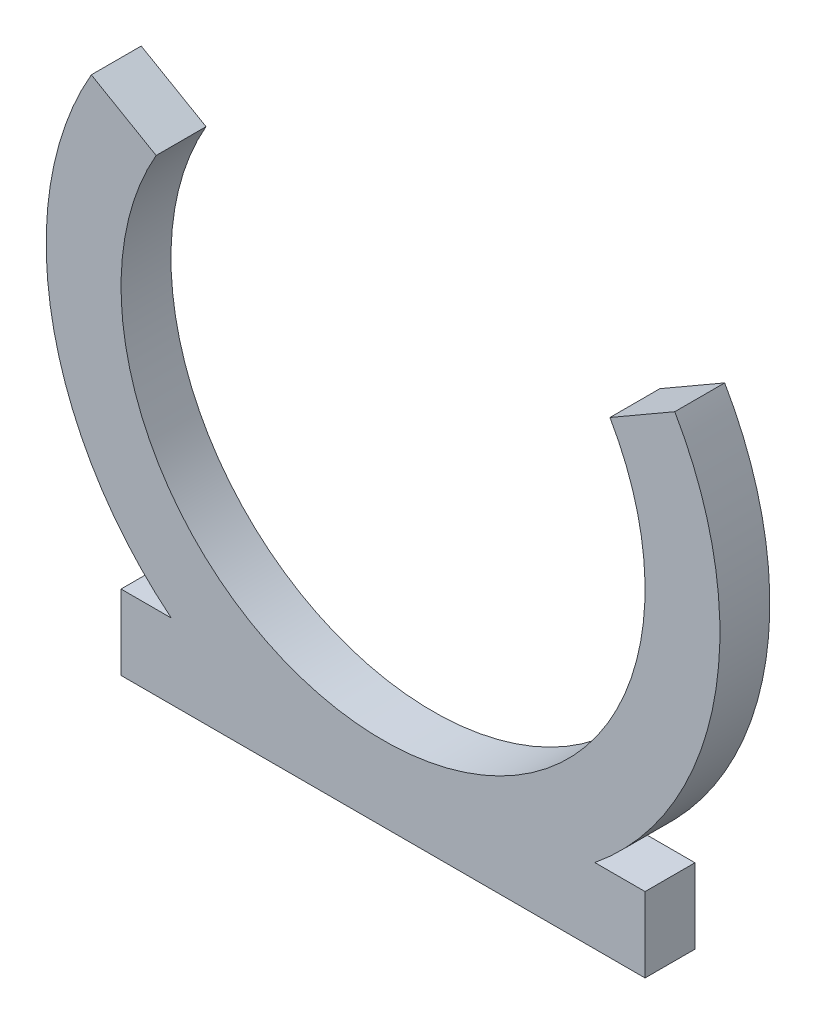
ISO-10303-21;
HEADER;
FILE_DESCRIPTION(('STEP AP214'),'2;1');
FILE_NAME('part.step','',(''),(''),'','','');
FILE_SCHEMA(('AUTOMOTIVE_DESIGN { 1 0 10303 214 1 1 1 1 }'));
ENDSEC;
DATA;
#1=APPLICATION_CONTEXT('core data for automotive mechanical design processes');
#2=APPLICATION_PROTOCOL_DEFINITION('international standard','automotive_design',2000,#1);
#3=PRODUCT_CONTEXT('',#1,'mechanical');
#4=PRODUCT('Part','Part','',(#3));
#5=PRODUCT_RELATED_PRODUCT_CATEGORY('part','',(#4));
#6=PRODUCT_DEFINITION_FORMATION('','',#4);
#7=PRODUCT_DEFINITION_CONTEXT('part definition',#1,'design');
#8=PRODUCT_DEFINITION('design','',#6,#7);
#9=PRODUCT_DEFINITION_SHAPE('','',#8);
#10=(LENGTH_UNIT() NAMED_UNIT(*) SI_UNIT(.MILLI.,.METRE.));
#11=(NAMED_UNIT(*) PLANE_ANGLE_UNIT() SI_UNIT($,.RADIAN.));
#12=(NAMED_UNIT(*) SI_UNIT($,.STERADIAN.) SOLID_ANGLE_UNIT());
#13=UNCERTAINTY_MEASURE_WITH_UNIT(LENGTH_MEASURE(1.E-05),#10,'distance_accuracy_value','');
#14=(GEOMETRIC_REPRESENTATION_CONTEXT(3) GLOBAL_UNCERTAINTY_ASSIGNED_CONTEXT((#13)) GLOBAL_UNIT_ASSIGNED_CONTEXT((#10,
#11,#12)) REPRESENTATION_CONTEXT('',''));
#15=CARTESIAN_POINT('',(0.,0.,0.));
#16=DIRECTION('',(0.,0.,1.));
#17=DIRECTION('',(1.,0.,0.));
#18=AXIS2_PLACEMENT_3D('',#15,#16,#17);
#19=CARTESIAN_POINT('',(0.,0.,2.));
#20=DIRECTION('',(0.,0.,-1.));
#21=DIRECTION('',(-1.,0.,0.));
#22=AXIS2_PLACEMENT_3D('',#19,#20,#21);
#23=CYLINDRICAL_SURFACE('',#22,10.5);
#24=CARTESIAN_POINT('',(0.,0.,0.));
#25=DIRECTION('',(0.,0.,-1.));
#26=DIRECTION('',(1.,0.,0.));
#27=AXIS2_PLACEMENT_3D('',#24,#25,#26);
#28=CIRCLE('',#27,10.5);
#29=CARTESIAN_POINT('',(9.09326673973662,5.24999999999998,0.));
#30=VERTEX_POINT('',#29);
#31=CARTESIAN_POINT('',(-9.09326673973662,5.24999999999998,0.));
#32=VERTEX_POINT('',#31);
#33=EDGE_CURVE('E152',#30,#32,#28,.T.);
#34=ORIENTED_EDGE('',*,*,#33,.T.);
#35=DIRECTION('',(0.,0.,-1.));
#36=VECTOR('',#35,1.);
#37=CARTESIAN_POINT('',(-9.09326673973662,5.24999999999998,2.));
#38=LINE('',#37,#36);
#39=CARTESIAN_POINT('',(-9.09326673973662,5.24999999999998,2.));
#40=VERTEX_POINT('',#39);
#41=EDGE_CURVE('E11',#40,#32,#38,.T.);
#42=ORIENTED_EDGE('',*,*,#41,.F.);
#43=CARTESIAN_POINT('',(0.,0.,2.));
#44=DIRECTION('',(0.,0.,-1.));
#45=DIRECTION('',(1.,0.,0.));
#46=AXIS2_PLACEMENT_3D('',#43,#44,#45);
#47=CIRCLE('',#46,10.5);
#48=CARTESIAN_POINT('',(9.09326673973662,5.24999999999998,2.));
#49=VERTEX_POINT('',#48);
#50=EDGE_CURVE('E180',#49,#40,#47,.T.);
#51=ORIENTED_EDGE('',*,*,#50,.F.);
#52=DIRECTION('',(0.,0.,-1.));
#53=VECTOR('',#52,1.);
#54=CARTESIAN_POINT('',(9.09326673973662,5.24999999999998,2.));
#55=LINE('',#54,#53);
#56=EDGE_CURVE('E148',#49,#30,#55,.T.);
#57=ORIENTED_EDGE('',*,*,#56,.T.);
#58=EDGE_LOOP('',(#34,#42,#51,#57));
#59=FACE_BOUND('',#58,.T.);
#60=ADVANCED_FACE('F39',(#59),#23,.F.);
#61=CARTESIAN_POINT('',(-9.09326673973662,5.24999999999998,2.));
#62=DIRECTION('',(-0.499999999999997,-0.86602540378444,0.));
#63=DIRECTION('',(0.86602540378444,-0.499999999999997,0.));
#64=AXIS2_PLACEMENT_3D('',#61,#62,#63);
#65=PLANE('',#64);
#66=DIRECTION('',(-0.86602540378444,0.499999999999997,0.));
#67=VECTOR('',#66,1.);
#68=CARTESIAN_POINT('',(-9.09326673973662,5.24999999999998,0.));
#69=LINE('',#68,#67);
#70=CARTESIAN_POINT('',(-11.6913429510899,6.74999999999997,0.));
#71=VERTEX_POINT('',#70);
#72=EDGE_CURVE('E156',#32,#71,#69,.T.);
#73=ORIENTED_EDGE('',*,*,#72,.T.);
#74=DIRECTION('',(0.,0.,-1.));
#75=VECTOR('',#74,1.);
#76=CARTESIAN_POINT('',(-11.6913429510899,6.74999999999997,2.));
#77=LINE('',#76,#75);
#78=CARTESIAN_POINT('',(-11.6913429510899,6.74999999999997,2.));
#79=VERTEX_POINT('',#78);
#80=EDGE_CURVE('E48',#79,#71,#77,.T.);
#81=ORIENTED_EDGE('',*,*,#80,.F.);
#82=DIRECTION('',(-0.86602540378444,0.499999999999997,0.));
#83=VECTOR('',#82,1.);
#84=CARTESIAN_POINT('',(-9.09326673973662,5.24999999999998,2.));
#85=LINE('',#84,#83);
#86=EDGE_CURVE('E105',#40,#79,#85,.T.);
#87=ORIENTED_EDGE('',*,*,#86,.F.);
#88=ORIENTED_EDGE('',*,*,#41,.T.);
#89=EDGE_LOOP('',(#73,#81,#87,#88));
#90=FACE_BOUND('',#89,.T.);
#91=ADVANCED_FACE('F244',(#90),#65,.F.);
#92=CARTESIAN_POINT('',(0.,0.,2.));
#93=DIRECTION('',(0.,0.,-1.));
#94=DIRECTION('',(-1.,0.,0.));
#95=AXIS2_PLACEMENT_3D('',#92,#93,#94);
#96=CYLINDRICAL_SURFACE('',#95,13.5);
#97=CARTESIAN_POINT('',(0.,0.,0.));
#98=DIRECTION('',(0.,0.,1.));
#99=DIRECTION('',(1.,0.,0.));
#100=AXIS2_PLACEMENT_3D('',#97,#98,#99);
#101=CIRCLE('',#100,13.5);
#102=CARTESIAN_POINT('',(-8.48528137423857,-10.5,0.));
#103=VERTEX_POINT('',#102);
#104=EDGE_CURVE('E159',#71,#103,#101,.T.);
#105=ORIENTED_EDGE('',*,*,#104,.T.);
#106=DIRECTION('',(0.,0.,-1.));
#107=VECTOR('',#106,1.);
#108=CARTESIAN_POINT('',(-8.48528137423857,-10.5,2.));
#109=LINE('',#108,#107);
#110=CARTESIAN_POINT('',(-8.48528137423857,-10.5,2.));
#111=VERTEX_POINT('',#110);
#112=EDGE_CURVE('E199',#111,#103,#109,.T.);
#113=ORIENTED_EDGE('',*,*,#112,.F.);
#114=CARTESIAN_POINT('',(0.,0.,2.));
#115=DIRECTION('',(0.,0.,1.));
#116=DIRECTION('',(1.,0.,0.));
#117=AXIS2_PLACEMENT_3D('',#114,#115,#116);
#118=CIRCLE('',#117,13.5);
#119=EDGE_CURVE('E209',#79,#111,#118,.T.);
#120=ORIENTED_EDGE('',*,*,#119,.F.);
#121=ORIENTED_EDGE('',*,*,#80,.T.);
#122=EDGE_LOOP('',(#105,#113,#120,#121));
#123=FACE_BOUND('',#122,.T.);
#124=ADVANCED_FACE('F207',(#123),#96,.T.);
#125=CARTESIAN_POINT('',(-10.5,-10.5,2.));
#126=DIRECTION('',(0.,-1.,0.));
#127=DIRECTION('',(1.,0.,0.));
#128=AXIS2_PLACEMENT_3D('',#125,#126,#127);
#129=PLANE('',#128);
#130=DIRECTION('',(-1.,0.,0.));
#131=VECTOR('',#130,1.);
#132=CARTESIAN_POINT('',(-10.5,-10.5,0.));
#133=LINE('',#132,#131);
#134=CARTESIAN_POINT('',(-10.5,-10.5,0.));
#135=VERTEX_POINT('',#134);
#136=EDGE_CURVE('E162',#103,#135,#133,.T.);
#137=ORIENTED_EDGE('',*,*,#136,.T.);
#138=DIRECTION('',(0.,0.,-1.));
#139=VECTOR('',#138,1.);
#140=CARTESIAN_POINT('',(-10.5,-10.5,2.));
#141=LINE('',#140,#139);
#142=CARTESIAN_POINT('',(-10.5,-10.5,2.));
#143=VERTEX_POINT('',#142);
#144=EDGE_CURVE('E195',#143,#135,#141,.T.);
#145=ORIENTED_EDGE('',*,*,#144,.F.);
#146=DIRECTION('',(-1.,0.,0.));
#147=VECTOR('',#146,1.);
#148=CARTESIAN_POINT('',(-10.5,-10.5,2.));
#149=LINE('',#148,#147);
#150=EDGE_CURVE('E228',#111,#143,#149,.T.);
#151=ORIENTED_EDGE('',*,*,#150,.F.);
#152=ORIENTED_EDGE('',*,*,#112,.T.);
#153=EDGE_LOOP('',(#137,#145,#151,#152));
#154=FACE_BOUND('',#153,.T.);
#155=ADVANCED_FACE('F218',(#154),#129,.F.);
#156=CARTESIAN_POINT('',(-10.5,-10.5,2.));
#157=DIRECTION('',(1.,0.,0.));
#158=DIRECTION('',(0.,1.,0.));
#159=AXIS2_PLACEMENT_3D('',#156,#157,#158);
#160=PLANE('',#159);
#161=DIRECTION('',(0.,-1.,0.));
#162=VECTOR('',#161,1.);
#163=CARTESIAN_POINT('',(-10.5,-10.5,0.));
#164=LINE('',#163,#162);
#165=CARTESIAN_POINT('',(-10.5,-13.5,0.));
#166=VERTEX_POINT('',#165);
#167=EDGE_CURVE('E165',#135,#166,#164,.T.);
#168=ORIENTED_EDGE('',*,*,#167,.T.);
#169=DIRECTION('',(0.,0.,-1.));
#170=VECTOR('',#169,1.);
#171=CARTESIAN_POINT('',(-10.5,-13.5,2.));
#172=LINE('',#171,#170);
#173=CARTESIAN_POINT('',(-10.5,-13.5,2.));
#174=VERTEX_POINT('',#173);
#175=EDGE_CURVE('E191',#174,#166,#172,.T.);
#176=ORIENTED_EDGE('',*,*,#175,.F.);
#177=DIRECTION('',(0.,-1.,0.));
#178=VECTOR('',#177,1.);
#179=CARTESIAN_POINT('',(-10.5,-10.5,2.));
#180=LINE('',#179,#178);
#181=EDGE_CURVE('E224',#143,#174,#180,.T.);
#182=ORIENTED_EDGE('',*,*,#181,.F.);
#183=ORIENTED_EDGE('',*,*,#144,.T.);
#184=EDGE_LOOP('',(#168,#176,#182,#183));
#185=FACE_BOUND('',#184,.T.);
#186=ADVANCED_FACE('F222',(#185),#160,.F.);
#187=CARTESIAN_POINT('',(-10.5,-13.5,2.));
#188=DIRECTION('',(0.,1.,0.));
#189=DIRECTION('',(0.,0.,1.));
#190=AXIS2_PLACEMENT_3D('',#187,#188,#189);
#191=PLANE('',#190);
#192=DIRECTION('',(1.,0.,0.));
#193=VECTOR('',#192,1.);
#194=CARTESIAN_POINT('',(-10.5,-13.5,0.));
#195=LINE('',#194,#193);
#196=CARTESIAN_POINT('',(10.5,-13.5,0.));
#197=VERTEX_POINT('',#196);
#198=EDGE_CURVE('E168',#166,#197,#195,.T.);
#199=ORIENTED_EDGE('',*,*,#198,.T.);
#200=DIRECTION('',(0.,0.,-1.));
#201=VECTOR('',#200,1.);
#202=CARTESIAN_POINT('',(10.5,-13.5,2.));
#203=LINE('',#202,#201);
#204=CARTESIAN_POINT('',(10.5,-13.5,2.));
#205=VERTEX_POINT('',#204);
#206=EDGE_CURVE('E187',#205,#197,#203,.T.);
#207=ORIENTED_EDGE('',*,*,#206,.F.);
#208=DIRECTION('',(1.,0.,0.));
#209=VECTOR('',#208,1.);
#210=CARTESIAN_POINT('',(-10.5,-13.5,2.));
#211=LINE('',#210,#209);
#212=EDGE_CURVE('E227',#174,#205,#211,.T.);
#213=ORIENTED_EDGE('',*,*,#212,.F.);
#214=ORIENTED_EDGE('',*,*,#175,.T.);
#215=EDGE_LOOP('',(#199,#207,#213,#214));
#216=FACE_BOUND('',#215,.T.);
#217=ADVANCED_FACE('F256',(#216),#191,.F.);
#218=CARTESIAN_POINT('',(10.5,-10.5,2.));
#219=DIRECTION('',(-1.,0.,0.));
#220=DIRECTION('',(0.,-1.,0.));
#221=AXIS2_PLACEMENT_3D('',#218,#219,#220);
#222=PLANE('',#221);
#223=DIRECTION('',(0.,1.,0.));
#224=VECTOR('',#223,1.);
#225=CARTESIAN_POINT('',(10.5,-10.5,0.));
#226=LINE('',#225,#224);
#227=CARTESIAN_POINT('',(10.5,-10.5,0.));
#228=VERTEX_POINT('',#227);
#229=EDGE_CURVE('E171',#197,#228,#226,.T.);
#230=ORIENTED_EDGE('',*,*,#229,.T.);
#231=DIRECTION('',(0.,0.,-1.));
#232=VECTOR('',#231,1.);
#233=CARTESIAN_POINT('',(10.5,-10.5,2.));
#234=LINE('',#233,#232);
#235=CARTESIAN_POINT('',(10.5,-10.5,2.));
#236=VERTEX_POINT('',#235);
#237=EDGE_CURVE('E141',#236,#228,#234,.T.);
#238=ORIENTED_EDGE('',*,*,#237,.F.);
#239=DIRECTION('',(0.,1.,0.));
#240=VECTOR('',#239,1.);
#241=CARTESIAN_POINT('',(10.5,-10.5,2.));
#242=LINE('',#241,#240);
#243=EDGE_CURVE('E130',#205,#236,#242,.T.);
#244=ORIENTED_EDGE('',*,*,#243,.F.);
#245=ORIENTED_EDGE('',*,*,#206,.T.);
#246=EDGE_LOOP('',(#230,#238,#244,#245));
#247=FACE_BOUND('',#246,.T.);
#248=ADVANCED_FACE('F259',(#247),#222,.F.);
#249=CARTESIAN_POINT('',(8.48528137423857,-10.5,2.));
#250=DIRECTION('',(0.,-1.,0.));
#251=DIRECTION('',(1.,0.,0.));
#252=AXIS2_PLACEMENT_3D('',#249,#250,#251);
#253=PLANE('',#252);
#254=DIRECTION('',(-1.,0.,0.));
#255=VECTOR('',#254,1.);
#256=CARTESIAN_POINT('',(8.48528137423857,-10.5,0.));
#257=LINE('',#256,#255);
#258=CARTESIAN_POINT('',(8.48528137423858,-10.5,0.));
#259=VERTEX_POINT('',#258);
#260=EDGE_CURVE('E139',#228,#259,#257,.T.);
#261=ORIENTED_EDGE('',*,*,#260,.T.);
#262=DIRECTION('',(0.,0.,-1.));
#263=VECTOR('',#262,1.);
#264=CARTESIAN_POINT('',(8.48528137423858,-10.5,2.));
#265=LINE('',#264,#263);
#266=CARTESIAN_POINT('',(8.48528137423858,-10.5,2.));
#267=VERTEX_POINT('',#266);
#268=EDGE_CURVE('E136',#267,#259,#265,.T.);
#269=ORIENTED_EDGE('',*,*,#268,.F.);
#270=DIRECTION('',(-1.,0.,0.));
#271=VECTOR('',#270,1.);
#272=CARTESIAN_POINT('',(8.48528137423857,-10.5,2.));
#273=LINE('',#272,#271);
#274=EDGE_CURVE('E124',#236,#267,#273,.T.);
#275=ORIENTED_EDGE('',*,*,#274,.F.);
#276=ORIENTED_EDGE('',*,*,#237,.T.);
#277=EDGE_LOOP('',(#261,#269,#275,#276));
#278=FACE_BOUND('',#277,.T.);
#279=ADVANCED_FACE('F137',(#278),#253,.F.);
#280=CARTESIAN_POINT('',(0.,0.,2.));
#281=DIRECTION('',(0.,0.,-1.));
#282=DIRECTION('',(-1.,0.,0.));
#283=AXIS2_PLACEMENT_3D('',#280,#281,#282);
#284=CYLINDRICAL_SURFACE('',#283,13.5);
#285=CARTESIAN_POINT('',(0.,0.,0.));
#286=DIRECTION('',(0.,0.,1.));
#287=DIRECTION('',(1.,0.,0.));
#288=AXIS2_PLACEMENT_3D('',#285,#286,#287);
#289=CIRCLE('',#288,13.5);
#290=CARTESIAN_POINT('',(11.6913429510899,6.74999999999997,0.));
#291=VERTEX_POINT('',#290);
#292=EDGE_CURVE('E91',#259,#291,#289,.T.);
#293=ORIENTED_EDGE('',*,*,#292,.T.);
#294=DIRECTION('',(0.,0.,-1.));
#295=VECTOR('',#294,1.);
#296=CARTESIAN_POINT('',(11.6913429510899,6.74999999999997,2.));
#297=LINE('',#296,#295);
#298=CARTESIAN_POINT('',(11.6913429510899,6.74999999999997,2.));
#299=VERTEX_POINT('',#298);
#300=EDGE_CURVE('E142',#299,#291,#297,.T.);
#301=ORIENTED_EDGE('',*,*,#300,.F.);
#302=CARTESIAN_POINT('',(0.,0.,2.));
#303=DIRECTION('',(0.,0.,1.));
#304=DIRECTION('',(1.,0.,0.));
#305=AXIS2_PLACEMENT_3D('',#302,#303,#304);
#306=CIRCLE('',#305,13.5);
#307=EDGE_CURVE('E128',#267,#299,#306,.T.);
#308=ORIENTED_EDGE('',*,*,#307,.F.);
#309=ORIENTED_EDGE('',*,*,#268,.T.);
#310=EDGE_LOOP('',(#293,#301,#308,#309));
#311=FACE_BOUND('',#310,.T.);
#312=ADVANCED_FACE('F144',(#311),#284,.T.);
#313=CARTESIAN_POINT('',(9.09326673973662,5.24999999999998,2.));
#314=DIRECTION('',(0.499999999999997,-0.86602540378444,0.));
#315=DIRECTION('',(0.86602540378444,0.499999999999997,0.));
#316=AXIS2_PLACEMENT_3D('',#313,#314,#315);
#317=PLANE('',#316);
#318=DIRECTION('',(-0.86602540378444,-0.499999999999997,0.));
#319=VECTOR('',#318,1.);
#320=CARTESIAN_POINT('',(9.09326673973662,5.24999999999998,0.));
#321=LINE('',#320,#319);
#322=EDGE_CURVE('E97',#291,#30,#321,.T.);
#323=ORIENTED_EDGE('',*,*,#322,.T.);
#324=ORIENTED_EDGE('',*,*,#56,.F.);
#325=DIRECTION('',(-0.86602540378444,-0.499999999999997,0.));
#326=VECTOR('',#325,1.);
#327=CARTESIAN_POINT('',(9.09326673973662,5.24999999999998,2.));
#328=LINE('',#327,#326);
#329=EDGE_CURVE('E56',#299,#49,#328,.T.);
#330=ORIENTED_EDGE('',*,*,#329,.F.);
#331=ORIENTED_EDGE('',*,*,#300,.T.);
#332=EDGE_LOOP('',(#323,#324,#330,#331));
#333=FACE_BOUND('',#332,.T.);
#334=ADVANCED_FACE('F268',(#333),#317,.F.);
#335=CARTESIAN_POINT('',(0.,0.,2.));
#336=DIRECTION('',(0.,0.,1.));
#337=DIRECTION('',(1.,0.,0.));
#338=AXIS2_PLACEMENT_3D('',#335,#336,#337);
#339=PLANE('',#338);
#340=ORIENTED_EDGE('',*,*,#50,.T.);
#341=ORIENTED_EDGE('',*,*,#86,.T.);
#342=ORIENTED_EDGE('',*,*,#119,.T.);
#343=ORIENTED_EDGE('',*,*,#150,.T.);
#344=ORIENTED_EDGE('',*,*,#181,.T.);
#345=ORIENTED_EDGE('',*,*,#212,.T.);
#346=ORIENTED_EDGE('',*,*,#243,.T.);
#347=ORIENTED_EDGE('',*,*,#274,.T.);
#348=ORIENTED_EDGE('',*,*,#307,.T.);
#349=ORIENTED_EDGE('',*,*,#329,.T.);
#350=EDGE_LOOP('',(#340,#341,#342,#343,#344,#345,#346,#347,#348,#349));
#351=FACE_BOUND('',#350,.T.);
#352=ADVANCED_FACE('F126',(#351),#339,.T.);
#353=CARTESIAN_POINT('',(0.,0.,0.));
#354=DIRECTION('',(0.,0.,1.));
#355=DIRECTION('',(1.,0.,0.));
#356=AXIS2_PLACEMENT_3D('',#353,#354,#355);
#357=PLANE('',#356);
#358=ORIENTED_EDGE('',*,*,#33,.F.);
#359=ORIENTED_EDGE('',*,*,#322,.F.);
#360=ORIENTED_EDGE('',*,*,#292,.F.);
#361=ORIENTED_EDGE('',*,*,#260,.F.);
#362=ORIENTED_EDGE('',*,*,#229,.F.);
#363=ORIENTED_EDGE('',*,*,#198,.F.);
#364=ORIENTED_EDGE('',*,*,#167,.F.);
#365=ORIENTED_EDGE('',*,*,#136,.F.);
#366=ORIENTED_EDGE('',*,*,#104,.F.);
#367=ORIENTED_EDGE('',*,*,#72,.F.);
#368=EDGE_LOOP('',(#358,#359,#360,#361,#362,#363,#364,#365,#366,#367));
#369=FACE_BOUND('',#368,.T.);
#370=ADVANCED_FACE('F213',(#369),#357,.F.);
#371=CLOSED_SHELL('',(#60,#91,#124,#155,#186,#217,#248,#279,#312,#334,#352,#370));
#372=MANIFOLD_SOLID_BREP('B2',#371);
#373=ADVANCED_BREP_SHAPE_REPRESENTATION('',(#18,#372),#14);
#374=SHAPE_DEFINITION_REPRESENTATION(#9,#373);
ENDSEC;
END-ISO-10303-21;
